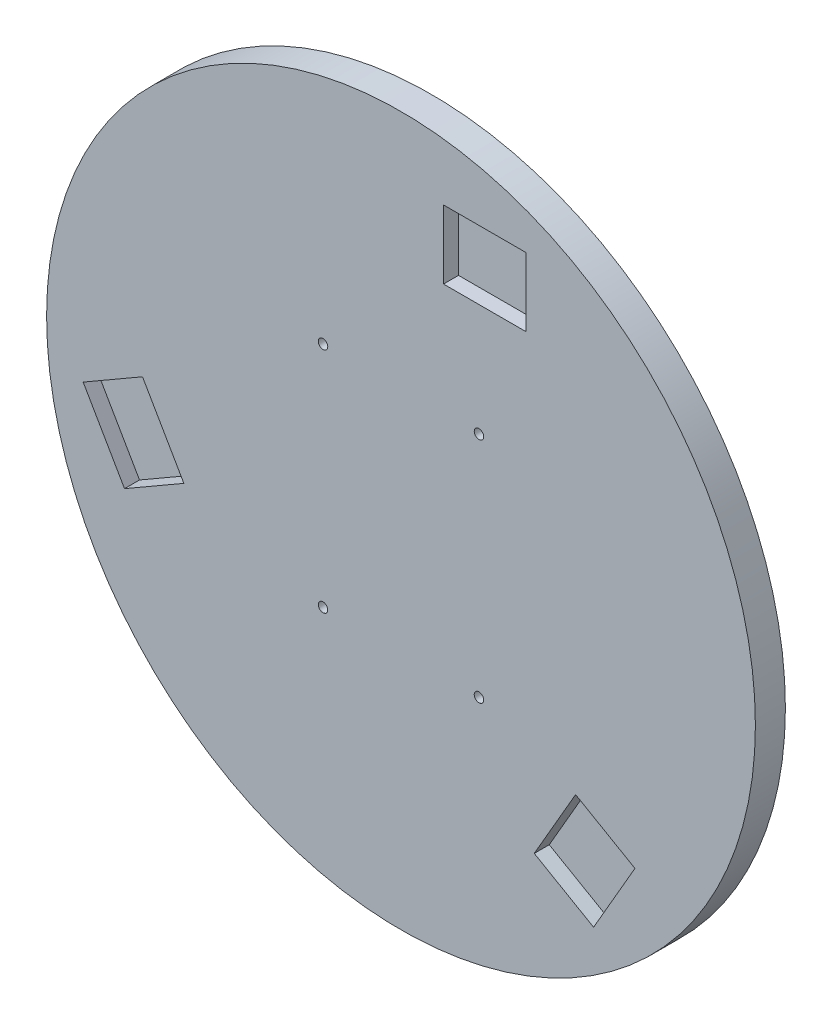
ISO-10303-21;
HEADER;
FILE_DESCRIPTION(('STEP AP214'),'2;1');
FILE_NAME('part.step','',(''),(''),'','','');
FILE_SCHEMA(('AUTOMOTIVE_DESIGN { 1 0 10303 214 1 1 1 1 }'));
ENDSEC;
DATA;
#1=APPLICATION_CONTEXT('core data for automotive mechanical design processes');
#2=APPLICATION_PROTOCOL_DEFINITION('international standard','automotive_design',2000,#1);
#3=PRODUCT_CONTEXT('',#1,'mechanical');
#4=PRODUCT('Part','Part','',(#3));
#5=PRODUCT_RELATED_PRODUCT_CATEGORY('part','',(#4));
#6=PRODUCT_DEFINITION_FORMATION('','',#4);
#7=PRODUCT_DEFINITION_CONTEXT('part definition',#1,'design');
#8=PRODUCT_DEFINITION('design','',#6,#7);
#9=PRODUCT_DEFINITION_SHAPE('','',#8);
#10=(LENGTH_UNIT() NAMED_UNIT(*) SI_UNIT(.MILLI.,.METRE.));
#11=(NAMED_UNIT(*) PLANE_ANGLE_UNIT() SI_UNIT($,.RADIAN.));
#12=(NAMED_UNIT(*) SI_UNIT($,.STERADIAN.) SOLID_ANGLE_UNIT());
#13=UNCERTAINTY_MEASURE_WITH_UNIT(LENGTH_MEASURE(1.E-05),#10,'distance_accuracy_value','');
#14=(GEOMETRIC_REPRESENTATION_CONTEXT(3) GLOBAL_UNCERTAINTY_ASSIGNED_CONTEXT((#13)) GLOBAL_UNIT_ASSIGNED_CONTEXT((#10,
#11,#12)) REPRESENTATION_CONTEXT('',''));
#15=CARTESIAN_POINT('',(0.,0.,0.));
#16=DIRECTION('',(0.,0.,1.));
#17=DIRECTION('',(1.,0.,0.));
#18=AXIS2_PLACEMENT_3D('',#15,#16,#17);
#19=CARTESIAN_POINT('',(0.,0.,12.7));
#20=DIRECTION('',(0.,0.,-1.));
#21=DIRECTION('',(-1.,0.,0.));
#22=AXIS2_PLACEMENT_3D('',#19,#20,#21);
#23=CYLINDRICAL_SURFACE('',#22,150.);
#24=CARTESIAN_POINT('',(0.,0.,12.7));
#25=DIRECTION('',(0.,0.,1.));
#26=DIRECTION('',(1.,0.,0.));
#27=AXIS2_PLACEMENT_3D('',#24,#25,#26);
#28=CIRCLE('',#27,150.);
#29=CARTESIAN_POINT('',(150.,0.,12.7));
#30=VERTEX_POINT('',#29);
#31=EDGE_CURVE('E11',#30,#30,#28,.T.);
#32=ORIENTED_EDGE('',*,*,#31,.F.);
#33=EDGE_LOOP('',(#32));
#34=FACE_BOUND('',#33,.T.);
#35=CARTESIAN_POINT('',(0.,0.,0.));
#36=DIRECTION('',(0.,0.,1.));
#37=DIRECTION('',(1.,0.,0.));
#38=AXIS2_PLACEMENT_3D('',#35,#36,#37);
#39=CIRCLE('',#38,150.);
#40=CARTESIAN_POINT('',(150.,0.,0.));
#41=VERTEX_POINT('',#40);
#42=EDGE_CURVE('E42',#41,#41,#39,.T.);
#43=ORIENTED_EDGE('',*,*,#42,.T.);
#44=EDGE_LOOP('',(#43));
#45=FACE_BOUND('',#44,.T.);
#46=ADVANCED_FACE('F39',(#34,#45),#23,.T.);
#47=CARTESIAN_POINT('',(0.,0.,12.7));
#48=DIRECTION('',(0.,0.,1.));
#49=DIRECTION('',(1.,0.,0.));
#50=AXIS2_PLACEMENT_3D('',#47,#48,#49);
#51=PLANE('',#50);
#52=DIRECTION('',(0.,-1.,0.));
#53=VECTOR('',#52,1.);
#54=CARTESIAN_POINT('',(18.,124.728215566818,12.7));
#55=LINE('',#54,#53);
#56=CARTESIAN_POINT('',(18.,124.728215566818,12.7));
#57=VERTEX_POINT('',#56);
#58=CARTESIAN_POINT('',(18.,95.728215566818,12.7));
#59=VERTEX_POINT('',#58);
#60=EDGE_CURVE('E54',#57,#59,#55,.T.);
#61=ORIENTED_EDGE('',*,*,#60,.F.);
#62=DIRECTION('',(-1.,0.,0.));
#63=VECTOR('',#62,1.);
#64=CARTESIAN_POINT('',(18.,124.728215566818,12.7));
#65=LINE('',#64,#63);
#66=CARTESIAN_POINT('',(53.,124.728215566818,12.7));
#67=VERTEX_POINT('',#66);
#68=EDGE_CURVE('E151',#67,#57,#65,.T.);
#69=ORIENTED_EDGE('',*,*,#68,.F.);
#70=DIRECTION('',(0.,1.,0.));
#71=VECTOR('',#70,1.);
#72=CARTESIAN_POINT('',(53.,124.728215566818,12.7));
#73=LINE('',#72,#71);
#74=CARTESIAN_POINT('',(53.,95.728215566818,12.7));
#75=VERTEX_POINT('',#74);
#76=EDGE_CURVE('E155',#75,#67,#73,.T.);
#77=ORIENTED_EDGE('',*,*,#76,.F.);
#78=DIRECTION('',(1.,0.,0.));
#79=VECTOR('',#78,1.);
#80=CARTESIAN_POINT('',(18.,95.728215566818,12.7));
#81=LINE('',#80,#79);
#82=EDGE_CURVE('E164',#59,#75,#81,.T.);
#83=ORIENTED_EDGE('',*,*,#82,.F.);
#84=EDGE_LOOP('',(#61,#69,#77,#83));
#85=FACE_BOUND('',#84,.T.);
#86=DIRECTION('',(-0.86602540378444,0.499999999999998,0.));
#87=VECTOR('',#86,1.);
#88=CARTESIAN_POINT('',(99.0178032495662,-77.9525650515289,12.7));
#89=LINE('',#88,#87);
#90=CARTESIAN_POINT('',(99.0178032495662,-77.9525650515289,12.7));
#91=VERTEX_POINT('',#90);
#92=CARTESIAN_POINT('',(73.9030665398174,-63.4525650515289,12.7));
#93=VERTEX_POINT('',#92);
#94=EDGE_CURVE('E62',#91,#93,#89,.T.);
#95=ORIENTED_EDGE('',*,*,#94,.F.);
#96=DIRECTION('',(0.499999999999998,0.86602540378444,0.));
#97=VECTOR('',#96,1.);
#98=CARTESIAN_POINT('',(81.5178032495662,-108.263454183984,12.7));
#99=LINE('',#98,#97);
#100=CARTESIAN_POINT('',(81.5178032495662,-108.263454183984,12.7));
#101=VERTEX_POINT('',#100);
#102=EDGE_CURVE('E185',#101,#91,#99,.T.);
#103=ORIENTED_EDGE('',*,*,#102,.F.);
#104=DIRECTION('',(0.86602540378444,-0.499999999999998,0.));
#105=VECTOR('',#104,1.);
#106=CARTESIAN_POINT('',(56.4030665398175,-93.7634541839843,12.7));
#107=LINE('',#106,#105);
#108=CARTESIAN_POINT('',(56.4030665398175,-93.7634541839843,12.7));
#109=VERTEX_POINT('',#108);
#110=EDGE_CURVE('E205',#109,#101,#107,.T.);
#111=ORIENTED_EDGE('',*,*,#110,.F.);
#112=DIRECTION('',(-0.499999999999998,-0.86602540378444,0.));
#113=VECTOR('',#112,1.);
#114=CARTESIAN_POINT('',(73.9030665398174,-63.4525650515289,12.7));
#115=LINE('',#114,#113);
#116=EDGE_CURVE('E200',#93,#109,#115,.T.);
#117=ORIENTED_EDGE('',*,*,#116,.F.);
#118=EDGE_LOOP('',(#95,#103,#111,#117));
#119=FACE_BOUND('',#118,.T.);
#120=DIRECTION('',(-0.866025403784439,-0.499999999999999,0.));
#121=VECTOR('',#120,1.);
#122=CARTESIAN_POINT('',(-134.517803249566,-16.4647613828338,12.7));
#123=LINE('',#122,#121);
#124=CARTESIAN_POINT('',(-109.403066539817,-1.9647613828338,12.7));
#125=VERTEX_POINT('',#124);
#126=CARTESIAN_POINT('',(-134.517803249566,-16.4647613828338,12.7));
#127=VERTEX_POINT('',#126);
#128=EDGE_CURVE('E240',#125,#127,#123,.T.);
#129=ORIENTED_EDGE('',*,*,#128,.F.);
#130=DIRECTION('',(-0.5,0.866025403784439,0.));
#131=VECTOR('',#130,1.);
#132=CARTESIAN_POINT('',(-109.403066539817,-1.9647613828338,12.7));
#133=LINE('',#132,#131);
#134=CARTESIAN_POINT('',(-91.9030665398173,-32.2756505152891,12.7));
#135=VERTEX_POINT('',#134);
#136=EDGE_CURVE('E227',#135,#125,#133,.T.);
#137=ORIENTED_EDGE('',*,*,#136,.F.);
#138=DIRECTION('',(0.866025403784439,0.5,0.));
#139=VECTOR('',#138,1.);
#140=CARTESIAN_POINT('',(-91.9030665398173,-32.2756505152891,12.7));
#141=LINE('',#140,#139);
#142=CARTESIAN_POINT('',(-117.017803249566,-46.7756505152891,12.7));
#143=VERTEX_POINT('',#142);
#144=EDGE_CURVE('E247',#143,#135,#141,.T.);
#145=ORIENTED_EDGE('',*,*,#144,.F.);
#146=DIRECTION('',(0.5,-0.866025403784439,0.));
#147=VECTOR('',#146,1.);
#148=CARTESIAN_POINT('',(-117.017803249566,-46.7756505152891,12.7));
#149=LINE('',#148,#147);
#150=EDGE_CURVE('E243',#127,#143,#149,.T.);
#151=ORIENTED_EDGE('',*,*,#150,.F.);
#152=EDGE_LOOP('',(#129,#137,#145,#151));
#153=FACE_BOUND('',#152,.T.);
#154=CARTESIAN_POINT('',(-33.,-48.25,12.7));
#155=DIRECTION('',(0.,0.,1.));
#156=DIRECTION('',(1.,0.,0.));
#157=AXIS2_PLACEMENT_3D('',#154,#155,#156);
#158=CIRCLE('',#157,2.);
#159=CARTESIAN_POINT('',(-31.,-48.25,12.7));
#160=VERTEX_POINT('',#159);
#161=EDGE_CURVE('E282',#160,#160,#158,.T.);
#162=ORIENTED_EDGE('',*,*,#161,.F.);
#163=EDGE_LOOP('',(#162));
#164=FACE_BOUND('',#163,.T.);
#165=CARTESIAN_POINT('',(33.,-48.25,12.7));
#166=DIRECTION('',(0.,0.,1.));
#167=DIRECTION('',(1.,0.,0.));
#168=AXIS2_PLACEMENT_3D('',#165,#166,#167);
#169=CIRCLE('',#168,2.);
#170=CARTESIAN_POINT('',(35.,-48.25,12.7));
#171=VERTEX_POINT('',#170);
#172=EDGE_CURVE('E274',#171,#171,#169,.T.);
#173=ORIENTED_EDGE('',*,*,#172,.F.);
#174=EDGE_LOOP('',(#173));
#175=FACE_BOUND('',#174,.T.);
#176=CARTESIAN_POINT('',(33.,48.25,12.7));
#177=DIRECTION('',(0.,0.,1.));
#178=DIRECTION('',(1.,0.,0.));
#179=AXIS2_PLACEMENT_3D('',#176,#177,#178);
#180=CIRCLE('',#179,2.);
#181=CARTESIAN_POINT('',(35.,48.25,12.7));
#182=VERTEX_POINT('',#181);
#183=EDGE_CURVE('E265',#182,#182,#180,.T.);
#184=ORIENTED_EDGE('',*,*,#183,.F.);
#185=EDGE_LOOP('',(#184));
#186=FACE_BOUND('',#185,.T.);
#187=CARTESIAN_POINT('',(-33.,48.25,12.7));
#188=DIRECTION('',(0.,0.,1.));
#189=DIRECTION('',(1.,0.,0.));
#190=AXIS2_PLACEMENT_3D('',#187,#188,#189);
#191=CIRCLE('',#190,1.99999999999987);
#192=CARTESIAN_POINT('',(-31.0000000000001,48.25,12.7));
#193=VERTEX_POINT('',#192);
#194=EDGE_CURVE('E269',#193,#193,#191,.T.);
#195=ORIENTED_EDGE('',*,*,#194,.F.);
#196=EDGE_LOOP('',(#195));
#197=FACE_BOUND('',#196,.T.);
#198=ORIENTED_EDGE('',*,*,#31,.T.);
#199=EDGE_LOOP('',(#198));
#200=FACE_BOUND('',#199,.T.);
#201=ADVANCED_FACE('F299',(#85,#119,#153,#164,#175,#186,#197,#200),#51,.T.);
#202=CARTESIAN_POINT('',(0.,0.,0.));
#203=DIRECTION('',(0.,0.,1.));
#204=DIRECTION('',(1.,0.,0.));
#205=AXIS2_PLACEMENT_3D('',#202,#203,#204);
#206=PLANE('',#205);
#207=CARTESIAN_POINT('',(-33.,-48.25,0.));
#208=DIRECTION('',(0.,0.,1.));
#209=DIRECTION('',(1.,0.,0.));
#210=AXIS2_PLACEMENT_3D('',#207,#208,#209);
#211=CIRCLE('',#210,2.);
#212=CARTESIAN_POINT('',(-31.,-48.25,0.));
#213=VERTEX_POINT('',#212);
#214=EDGE_CURVE('E174',#213,#213,#211,.T.);
#215=ORIENTED_EDGE('',*,*,#214,.T.);
#216=EDGE_LOOP('',(#215));
#217=FACE_BOUND('',#216,.T.);
#218=CARTESIAN_POINT('',(33.,-48.25,0.));
#219=DIRECTION('',(0.,0.,1.));
#220=DIRECTION('',(1.,0.,0.));
#221=AXIS2_PLACEMENT_3D('',#218,#219,#220);
#222=CIRCLE('',#221,2.);
#223=CARTESIAN_POINT('',(35.,-48.25,0.));
#224=VERTEX_POINT('',#223);
#225=EDGE_CURVE('E278',#224,#224,#222,.T.);
#226=ORIENTED_EDGE('',*,*,#225,.T.);
#227=EDGE_LOOP('',(#226));
#228=FACE_BOUND('',#227,.T.);
#229=CARTESIAN_POINT('',(33.,48.25,0.));
#230=DIRECTION('',(0.,0.,1.));
#231=DIRECTION('',(1.,0.,0.));
#232=AXIS2_PLACEMENT_3D('',#229,#230,#231);
#233=CIRCLE('',#232,2.);
#234=CARTESIAN_POINT('',(35.,48.25,0.));
#235=VERTEX_POINT('',#234);
#236=EDGE_CURVE('E270',#235,#235,#233,.T.);
#237=ORIENTED_EDGE('',*,*,#236,.T.);
#238=EDGE_LOOP('',(#237));
#239=FACE_BOUND('',#238,.T.);
#240=CARTESIAN_POINT('',(-33.,48.25,0.));
#241=DIRECTION('',(0.,0.,1.));
#242=DIRECTION('',(1.,0.,0.));
#243=AXIS2_PLACEMENT_3D('',#240,#241,#242);
#244=CIRCLE('',#243,1.99999999999987);
#245=CARTESIAN_POINT('',(-31.0000000000001,48.25,0.));
#246=VERTEX_POINT('',#245);
#247=EDGE_CURVE('E289',#246,#246,#244,.T.);
#248=ORIENTED_EDGE('',*,*,#247,.T.);
#249=EDGE_LOOP('',(#248));
#250=FACE_BOUND('',#249,.T.);
#251=ORIENTED_EDGE('',*,*,#42,.F.);
#252=EDGE_LOOP('',(#251));
#253=FACE_BOUND('',#252,.T.);
#254=ADVANCED_FACE('F302',(#217,#228,#239,#250,#253),#206,.F.);
#255=CARTESIAN_POINT('',(-33.,48.25,0.));
#256=DIRECTION('',(0.,0.,1.));
#257=DIRECTION('',(1.,0.,0.));
#258=AXIS2_PLACEMENT_3D('',#255,#256,#257);
#259=CYLINDRICAL_SURFACE('',#258,1.99999999999987);
#260=ORIENTED_EDGE('',*,*,#247,.F.);
#261=EDGE_LOOP('',(#260));
#262=FACE_BOUND('',#261,.T.);
#263=ORIENTED_EDGE('',*,*,#194,.T.);
#264=EDGE_LOOP('',(#263));
#265=FACE_BOUND('',#264,.T.);
#266=ADVANCED_FACE('F297',(#262,#265),#259,.F.);
#267=CARTESIAN_POINT('',(33.,48.25,0.));
#268=DIRECTION('',(0.,0.,1.));
#269=DIRECTION('',(1.,0.,0.));
#270=AXIS2_PLACEMENT_3D('',#267,#268,#269);
#271=CYLINDRICAL_SURFACE('',#270,2.);
#272=ORIENTED_EDGE('',*,*,#236,.F.);
#273=EDGE_LOOP('',(#272));
#274=FACE_BOUND('',#273,.T.);
#275=ORIENTED_EDGE('',*,*,#183,.T.);
#276=EDGE_LOOP('',(#275));
#277=FACE_BOUND('',#276,.T.);
#278=ADVANCED_FACE('F318',(#274,#277),#271,.F.);
#279=CARTESIAN_POINT('',(33.,-48.25,0.));
#280=DIRECTION('',(0.,0.,1.));
#281=DIRECTION('',(1.,0.,0.));
#282=AXIS2_PLACEMENT_3D('',#279,#280,#281);
#283=CYLINDRICAL_SURFACE('',#282,2.);
#284=ORIENTED_EDGE('',*,*,#225,.F.);
#285=EDGE_LOOP('',(#284));
#286=FACE_BOUND('',#285,.T.);
#287=ORIENTED_EDGE('',*,*,#172,.T.);
#288=EDGE_LOOP('',(#287));
#289=FACE_BOUND('',#288,.T.);
#290=ADVANCED_FACE('F327',(#286,#289),#283,.F.);
#291=CARTESIAN_POINT('',(-33.,-48.25,0.));
#292=DIRECTION('',(0.,0.,1.));
#293=DIRECTION('',(1.,0.,0.));
#294=AXIS2_PLACEMENT_3D('',#291,#292,#293);
#295=CYLINDRICAL_SURFACE('',#294,2.);
#296=ORIENTED_EDGE('',*,*,#214,.F.);
#297=EDGE_LOOP('',(#296));
#298=FACE_BOUND('',#297,.T.);
#299=ORIENTED_EDGE('',*,*,#161,.T.);
#300=EDGE_LOOP('',(#299));
#301=FACE_BOUND('',#300,.T.);
#302=ADVANCED_FACE('F323',(#298,#301),#295,.F.);
#303=CARTESIAN_POINT('',(-134.517803249566,-16.4647613828338,6.35));
#304=DIRECTION('',(-0.499999999999999,0.866025403784439,0.));
#305=DIRECTION('',(-0.866025403784439,-0.499999999999999,0.));
#306=AXIS2_PLACEMENT_3D('',#303,#304,#305);
#307=PLANE('',#306);
#308=ORIENTED_EDGE('',*,*,#128,.T.);
#309=DIRECTION('',(0.,0.,1.));
#310=VECTOR('',#309,1.);
#311=CARTESIAN_POINT('',(-134.517803249566,-16.4647613828338,6.35));
#312=LINE('',#311,#310);
#313=CARTESIAN_POINT('',(-134.517803249566,-16.4647613828338,6.35));
#314=VERTEX_POINT('',#313);
#315=EDGE_CURVE('E239',#314,#127,#312,.T.);
#316=ORIENTED_EDGE('',*,*,#315,.F.);
#317=DIRECTION('',(-0.866025403784439,-0.499999999999999,0.));
#318=VECTOR('',#317,1.);
#319=CARTESIAN_POINT('',(-134.517803249566,-16.4647613828338,6.35));
#320=LINE('',#319,#318);
#321=CARTESIAN_POINT('',(-109.403066539817,-1.9647613828338,6.35));
#322=VERTEX_POINT('',#321);
#323=EDGE_CURVE('E222',#322,#314,#320,.T.);
#324=ORIENTED_EDGE('',*,*,#323,.F.);
#325=DIRECTION('',(0.,0.,1.));
#326=VECTOR('',#325,1.);
#327=CARTESIAN_POINT('',(-109.403066539817,-1.9647613828338,6.35));
#328=LINE('',#327,#326);
#329=EDGE_CURVE('E201',#322,#125,#328,.T.);
#330=ORIENTED_EDGE('',*,*,#329,.T.);
#331=EDGE_LOOP('',(#308,#316,#324,#330));
#332=FACE_BOUND('',#331,.T.);
#333=ADVANCED_FACE('F326',(#332),#307,.F.);
#334=CARTESIAN_POINT('',(-109.403066539817,-1.9647613828338,6.35));
#335=DIRECTION('',(0.866025403784439,0.5,0.));
#336=DIRECTION('',(-0.5,0.866025403784439,0.));
#337=AXIS2_PLACEMENT_3D('',#334,#335,#336);
#338=PLANE('',#337);
#339=ORIENTED_EDGE('',*,*,#136,.T.);
#340=ORIENTED_EDGE('',*,*,#329,.F.);
#341=DIRECTION('',(-0.5,0.866025403784439,0.));
#342=VECTOR('',#341,1.);
#343=CARTESIAN_POINT('',(-109.403066539817,-1.9647613828338,6.35));
#344=LINE('',#343,#342);
#345=CARTESIAN_POINT('',(-91.9030665398173,-32.2756505152891,6.35));
#346=VERTEX_POINT('',#345);
#347=EDGE_CURVE('E235',#346,#322,#344,.T.);
#348=ORIENTED_EDGE('',*,*,#347,.F.);
#349=DIRECTION('',(0.,0.,1.));
#350=VECTOR('',#349,1.);
#351=CARTESIAN_POINT('',(-91.9030665398173,-32.2756505152891,6.35));
#352=LINE('',#351,#350);
#353=EDGE_CURVE('E256',#346,#135,#352,.T.);
#354=ORIENTED_EDGE('',*,*,#353,.T.);
#355=EDGE_LOOP('',(#339,#340,#348,#354));
#356=FACE_BOUND('',#355,.T.);
#357=ADVANCED_FACE('F337',(#356),#338,.F.);
#358=CARTESIAN_POINT('',(-91.9030665398173,-32.2756505152891,6.35));
#359=DIRECTION('',(0.5,-0.866025403784439,0.));
#360=DIRECTION('',(0.866025403784439,0.5,0.));
#361=AXIS2_PLACEMENT_3D('',#358,#359,#360);
#362=PLANE('',#361);
#363=ORIENTED_EDGE('',*,*,#144,.T.);
#364=ORIENTED_EDGE('',*,*,#353,.F.);
#365=DIRECTION('',(0.866025403784439,0.5,0.));
#366=VECTOR('',#365,1.);
#367=CARTESIAN_POINT('',(-91.9030665398173,-32.2756505152891,6.35));
#368=LINE('',#367,#366);
#369=CARTESIAN_POINT('',(-117.017803249566,-46.7756505152891,6.35));
#370=VERTEX_POINT('',#369);
#371=EDGE_CURVE('E231',#370,#346,#368,.T.);
#372=ORIENTED_EDGE('',*,*,#371,.F.);
#373=DIRECTION('',(0.,0.,1.));
#374=VECTOR('',#373,1.);
#375=CARTESIAN_POINT('',(-117.017803249566,-46.7756505152891,6.35));
#376=LINE('',#375,#374);
#377=EDGE_CURVE('E259',#370,#143,#376,.T.);
#378=ORIENTED_EDGE('',*,*,#377,.T.);
#379=EDGE_LOOP('',(#363,#364,#372,#378));
#380=FACE_BOUND('',#379,.T.);
#381=ADVANCED_FACE('F343',(#380),#362,.F.);
#382=CARTESIAN_POINT('',(-117.017803249566,-46.7756505152891,6.35));
#383=DIRECTION('',(-0.866025403784439,-0.5,0.));
#384=DIRECTION('',(0.5,-0.866025403784439,0.));
#385=AXIS2_PLACEMENT_3D('',#382,#383,#384);
#386=PLANE('',#385);
#387=ORIENTED_EDGE('',*,*,#150,.T.);
#388=ORIENTED_EDGE('',*,*,#377,.F.);
#389=DIRECTION('',(0.5,-0.866025403784439,0.));
#390=VECTOR('',#389,1.);
#391=CARTESIAN_POINT('',(-117.017803249566,-46.7756505152891,6.35));
#392=LINE('',#391,#390);
#393=EDGE_CURVE('E226',#314,#370,#392,.T.);
#394=ORIENTED_EDGE('',*,*,#393,.F.);
#395=ORIENTED_EDGE('',*,*,#315,.T.);
#396=EDGE_LOOP('',(#387,#388,#394,#395));
#397=FACE_BOUND('',#396,.T.);
#398=ADVANCED_FACE('F339',(#397),#386,.F.);
#399=CARTESIAN_POINT('',(0.,0.,6.35));
#400=DIRECTION('',(0.,0.,-1.));
#401=DIRECTION('',(-1.,0.,0.));
#402=AXIS2_PLACEMENT_3D('',#399,#400,#401);
#403=PLANE('',#402);
#404=ORIENTED_EDGE('',*,*,#323,.T.);
#405=ORIENTED_EDGE('',*,*,#393,.T.);
#406=ORIENTED_EDGE('',*,*,#371,.T.);
#407=ORIENTED_EDGE('',*,*,#347,.T.);
#408=EDGE_LOOP('',(#404,#405,#406,#407));
#409=FACE_BOUND('',#408,.T.);
#410=ADVANCED_FACE('F342',(#409),#403,.F.);
#411=CARTESIAN_POINT('',(99.0178032495662,-77.9525650515289,6.35));
#412=DIRECTION('',(0.499999999999998,0.866025403784439,0.));
#413=DIRECTION('',(-0.86602540378444,0.499999999999998,0.));
#414=AXIS2_PLACEMENT_3D('',#411,#412,#413);
#415=PLANE('',#414);
#416=ORIENTED_EDGE('',*,*,#94,.T.);
#417=DIRECTION('',(0.,0.,1.));
#418=VECTOR('',#417,1.);
#419=CARTESIAN_POINT('',(73.9030665398174,-63.4525650515289,6.35));
#420=LINE('',#419,#418);
#421=CARTESIAN_POINT('',(73.9030665398174,-63.4525650515289,6.35));
#422=VERTEX_POINT('',#421);
#423=EDGE_CURVE('E197',#422,#93,#420,.T.);
#424=ORIENTED_EDGE('',*,*,#423,.F.);
#425=DIRECTION('',(-0.86602540378444,0.499999999999998,0.));
#426=VECTOR('',#425,1.);
#427=CARTESIAN_POINT('',(99.0178032495662,-77.9525650515289,6.35));
#428=LINE('',#427,#426);
#429=CARTESIAN_POINT('',(99.0178032495662,-77.9525650515289,6.35));
#430=VERTEX_POINT('',#429);
#431=EDGE_CURVE('E180',#430,#422,#428,.T.);
#432=ORIENTED_EDGE('',*,*,#431,.F.);
#433=DIRECTION('',(0.,0.,1.));
#434=VECTOR('',#433,1.);
#435=CARTESIAN_POINT('',(99.0178032495662,-77.9525650515289,6.35));
#436=LINE('',#435,#434);
#437=EDGE_CURVE('E165',#430,#91,#436,.T.);
#438=ORIENTED_EDGE('',*,*,#437,.T.);
#439=EDGE_LOOP('',(#416,#424,#432,#438));
#440=FACE_BOUND('',#439,.T.);
#441=ADVANCED_FACE('F353',(#440),#415,.F.);
#442=CARTESIAN_POINT('',(81.5178032495662,-108.263454183984,6.35));
#443=DIRECTION('',(0.86602540378444,-0.499999999999998,0.));
#444=DIRECTION('',(0.499999999999998,0.86602540378444,0.));
#445=AXIS2_PLACEMENT_3D('',#442,#443,#444);
#446=PLANE('',#445);
#447=ORIENTED_EDGE('',*,*,#102,.T.);
#448=ORIENTED_EDGE('',*,*,#437,.F.);
#449=DIRECTION('',(0.499999999999998,0.86602540378444,0.));
#450=VECTOR('',#449,1.);
#451=CARTESIAN_POINT('',(81.5178032495662,-108.263454183984,6.35));
#452=LINE('',#451,#450);
#453=CARTESIAN_POINT('',(81.5178032495662,-108.263454183984,6.35));
#454=VERTEX_POINT('',#453);
#455=EDGE_CURVE('E193',#454,#430,#452,.T.);
#456=ORIENTED_EDGE('',*,*,#455,.F.);
#457=DIRECTION('',(0.,0.,1.));
#458=VECTOR('',#457,1.);
#459=CARTESIAN_POINT('',(81.5178032495662,-108.263454183984,6.35));
#460=LINE('',#459,#458);
#461=EDGE_CURVE('E214',#454,#101,#460,.T.);
#462=ORIENTED_EDGE('',*,*,#461,.T.);
#463=EDGE_LOOP('',(#447,#448,#456,#462));
#464=FACE_BOUND('',#463,.T.);
#465=ADVANCED_FACE('F357',(#464),#446,.F.);
#466=CARTESIAN_POINT('',(56.4030665398175,-93.7634541839843,6.35));
#467=DIRECTION('',(-0.499999999999998,-0.86602540378444,0.));
#468=DIRECTION('',(0.86602540378444,-0.499999999999998,0.));
#469=AXIS2_PLACEMENT_3D('',#466,#467,#468);
#470=PLANE('',#469);
#471=ORIENTED_EDGE('',*,*,#110,.T.);
#472=ORIENTED_EDGE('',*,*,#461,.F.);
#473=DIRECTION('',(0.86602540378444,-0.499999999999998,0.));
#474=VECTOR('',#473,1.);
#475=CARTESIAN_POINT('',(56.4030665398175,-93.7634541839843,6.35));
#476=LINE('',#475,#474);
#477=CARTESIAN_POINT('',(56.4030665398175,-93.7634541839843,6.35));
#478=VERTEX_POINT('',#477);
#479=EDGE_CURVE('E189',#478,#454,#476,.T.);
#480=ORIENTED_EDGE('',*,*,#479,.F.);
#481=DIRECTION('',(0.,0.,1.));
#482=VECTOR('',#481,1.);
#483=CARTESIAN_POINT('',(56.4030665398175,-93.7634541839843,6.35));
#484=LINE('',#483,#482);
#485=EDGE_CURVE('E217',#478,#109,#484,.T.);
#486=ORIENTED_EDGE('',*,*,#485,.T.);
#487=EDGE_LOOP('',(#471,#472,#480,#486));
#488=FACE_BOUND('',#487,.T.);
#489=ADVANCED_FACE('F362',(#488),#470,.F.);
#490=CARTESIAN_POINT('',(73.9030665398174,-63.4525650515289,6.35));
#491=DIRECTION('',(-0.86602540378444,0.499999999999998,0.));
#492=DIRECTION('',(-0.499999999999998,-0.86602540378444,0.));
#493=AXIS2_PLACEMENT_3D('',#490,#491,#492);
#494=PLANE('',#493);
#495=ORIENTED_EDGE('',*,*,#116,.T.);
#496=ORIENTED_EDGE('',*,*,#485,.F.);
#497=DIRECTION('',(-0.499999999999998,-0.86602540378444,0.));
#498=VECTOR('',#497,1.);
#499=CARTESIAN_POINT('',(73.9030665398174,-63.4525650515289,6.35));
#500=LINE('',#499,#498);
#501=EDGE_CURVE('E184',#422,#478,#500,.T.);
#502=ORIENTED_EDGE('',*,*,#501,.F.);
#503=ORIENTED_EDGE('',*,*,#423,.T.);
#504=EDGE_LOOP('',(#495,#496,#502,#503));
#505=FACE_BOUND('',#504,.T.);
#506=ADVANCED_FACE('F358',(#505),#494,.F.);
#507=CARTESIAN_POINT('',(0.,0.,6.35));
#508=DIRECTION('',(0.,0.,1.));
#509=DIRECTION('',(1.,0.,0.));
#510=AXIS2_PLACEMENT_3D('',#507,#508,#509);
#511=PLANE('',#510);
#512=ORIENTED_EDGE('',*,*,#431,.T.);
#513=ORIENTED_EDGE('',*,*,#501,.T.);
#514=ORIENTED_EDGE('',*,*,#479,.T.);
#515=ORIENTED_EDGE('',*,*,#455,.T.);
#516=EDGE_LOOP('',(#512,#513,#514,#515));
#517=FACE_BOUND('',#516,.T.);
#518=ADVANCED_FACE('F361',(#517),#511,.T.);
#519=CARTESIAN_POINT('',(18.,124.728215566818,6.35));
#520=DIRECTION('',(-1.,0.,0.));
#521=DIRECTION('',(0.,-1.,0.));
#522=AXIS2_PLACEMENT_3D('',#519,#520,#521);
#523=PLANE('',#522);
#524=ORIENTED_EDGE('',*,*,#60,.T.);
#525=DIRECTION('',(0.,0.,1.));
#526=VECTOR('',#525,1.);
#527=CARTESIAN_POINT('',(18.,95.728215566818,6.35));
#528=LINE('',#527,#526);
#529=CARTESIAN_POINT('',(18.,95.728215566818,6.35));
#530=VERTEX_POINT('',#529);
#531=EDGE_CURVE('E126',#530,#59,#528,.T.);
#532=ORIENTED_EDGE('',*,*,#531,.F.);
#533=DIRECTION('',(0.,-1.,0.));
#534=VECTOR('',#533,1.);
#535=CARTESIAN_POINT('',(18.,124.728215566818,6.35));
#536=LINE('',#535,#534);
#537=CARTESIAN_POINT('',(18.,124.728215566818,6.35));
#538=VERTEX_POINT('',#537);
#539=EDGE_CURVE('E130',#538,#530,#536,.T.);
#540=ORIENTED_EDGE('',*,*,#539,.F.);
#541=DIRECTION('',(0.,0.,1.));
#542=VECTOR('',#541,1.);
#543=CARTESIAN_POINT('',(18.,124.728215566818,6.35));
#544=LINE('',#543,#542);
#545=EDGE_CURVE('E171',#538,#57,#544,.T.);
#546=ORIENTED_EDGE('',*,*,#545,.T.);
#547=EDGE_LOOP('',(#524,#532,#540,#546));
#548=FACE_BOUND('',#547,.T.);
#549=ADVANCED_FACE('F128',(#548),#523,.F.);
#550=CARTESIAN_POINT('',(18.,124.728215566818,6.35));
#551=DIRECTION('',(0.,1.,0.));
#552=DIRECTION('',(0.,0.,1.));
#553=AXIS2_PLACEMENT_3D('',#550,#551,#552);
#554=PLANE('',#553);
#555=ORIENTED_EDGE('',*,*,#68,.T.);
#556=ORIENTED_EDGE('',*,*,#545,.F.);
#557=DIRECTION('',(-1.,0.,0.));
#558=VECTOR('',#557,1.);
#559=CARTESIAN_POINT('',(18.,124.728215566818,6.35));
#560=LINE('',#559,#558);
#561=CARTESIAN_POINT('',(53.,124.728215566818,6.35));
#562=VERTEX_POINT('',#561);
#563=EDGE_CURVE('E137',#562,#538,#560,.T.);
#564=ORIENTED_EDGE('',*,*,#563,.F.);
#565=DIRECTION('',(0.,0.,1.));
#566=VECTOR('',#565,1.);
#567=CARTESIAN_POINT('',(53.,124.728215566818,6.35));
#568=LINE('',#567,#566);
#569=EDGE_CURVE('E175',#562,#67,#568,.T.);
#570=ORIENTED_EDGE('',*,*,#569,.T.);
#571=EDGE_LOOP('',(#555,#556,#564,#570));
#572=FACE_BOUND('',#571,.T.);
#573=ADVANCED_FACE('F375',(#572),#554,.F.);
#574=CARTESIAN_POINT('',(53.,124.728215566818,6.35));
#575=DIRECTION('',(1.,0.,0.));
#576=DIRECTION('',(0.,1.,0.));
#577=AXIS2_PLACEMENT_3D('',#574,#575,#576);
#578=PLANE('',#577);
#579=ORIENTED_EDGE('',*,*,#76,.T.);
#580=ORIENTED_EDGE('',*,*,#569,.F.);
#581=DIRECTION('',(0.,1.,0.));
#582=VECTOR('',#581,1.);
#583=CARTESIAN_POINT('',(53.,124.728215566818,6.35));
#584=LINE('',#583,#582);
#585=CARTESIAN_POINT('',(53.,95.728215566818,6.35));
#586=VERTEX_POINT('',#585);
#587=EDGE_CURVE('E146',#586,#562,#584,.T.);
#588=ORIENTED_EDGE('',*,*,#587,.F.);
#589=DIRECTION('',(0.,0.,1.));
#590=VECTOR('',#589,1.);
#591=CARTESIAN_POINT('',(53.,95.728215566818,6.35));
#592=LINE('',#591,#590);
#593=EDGE_CURVE('E136',#586,#75,#592,.T.);
#594=ORIENTED_EDGE('',*,*,#593,.T.);
#595=EDGE_LOOP('',(#579,#580,#588,#594));
#596=FACE_BOUND('',#595,.T.);
#597=ADVANCED_FACE('F378',(#596),#578,.F.);
#598=CARTESIAN_POINT('',(18.,95.728215566818,6.35));
#599=DIRECTION('',(0.,-1.,0.));
#600=DIRECTION('',(1.,0.,0.));
#601=AXIS2_PLACEMENT_3D('',#598,#599,#600);
#602=PLANE('',#601);
#603=ORIENTED_EDGE('',*,*,#82,.T.);
#604=ORIENTED_EDGE('',*,*,#593,.F.);
#605=DIRECTION('',(1.,0.,0.));
#606=VECTOR('',#605,1.);
#607=CARTESIAN_POINT('',(18.,95.728215566818,6.35));
#608=LINE('',#607,#606);
#609=EDGE_CURVE('E140',#530,#586,#608,.T.);
#610=ORIENTED_EDGE('',*,*,#609,.F.);
#611=ORIENTED_EDGE('',*,*,#531,.T.);
#612=EDGE_LOOP('',(#603,#604,#610,#611));
#613=FACE_BOUND('',#612,.T.);
#614=ADVANCED_FACE('F141',(#613),#602,.F.);
#615=CARTESIAN_POINT('',(0.,0.,6.35));
#616=DIRECTION('',(0.,0.,1.));
#617=DIRECTION('',(1.,0.,0.));
#618=AXIS2_PLACEMENT_3D('',#615,#616,#617);
#619=PLANE('',#618);
#620=ORIENTED_EDGE('',*,*,#539,.T.);
#621=ORIENTED_EDGE('',*,*,#609,.T.);
#622=ORIENTED_EDGE('',*,*,#587,.T.);
#623=ORIENTED_EDGE('',*,*,#563,.T.);
#624=EDGE_LOOP('',(#620,#621,#622,#623));
#625=FACE_BOUND('',#624,.T.);
#626=ADVANCED_FACE('F148',(#625),#619,.T.);
#627=CLOSED_SHELL('',(#46,#201,#254,#266,#278,#290,#302,#333,#357,#381,#398,#410,#441,#465,#489,
#506,#518,#549,#573,#597,#614,#626));
#628=MANIFOLD_SOLID_BREP('B2',#627);
#629=ADVANCED_BREP_SHAPE_REPRESENTATION('',(#18,#628),#14);
#630=SHAPE_DEFINITION_REPRESENTATION(#9,#629);
ENDSEC;
END-ISO-10303-21;
